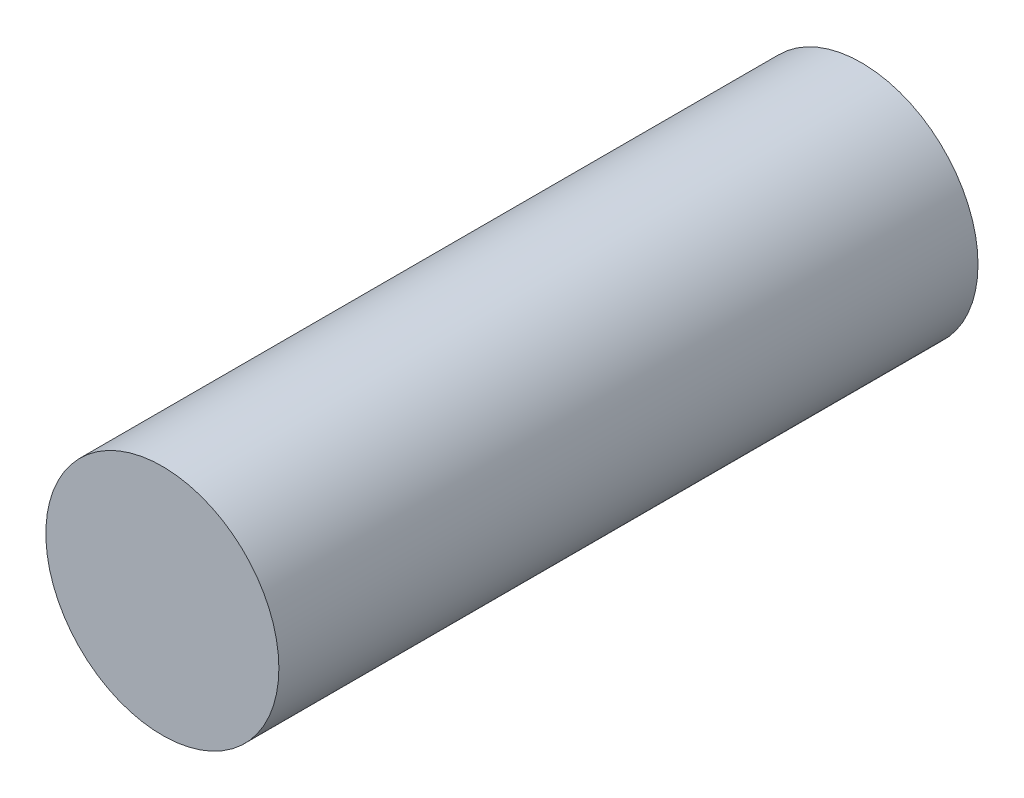
ISO-10303-21;
HEADER;
FILE_DESCRIPTION(('STEP AP214'),'2;1');
FILE_NAME('part.step','',(''),(''),'','','');
FILE_SCHEMA(('AUTOMOTIVE_DESIGN { 1 0 10303 214 1 1 1 1 }'));
ENDSEC;
DATA;
#1=APPLICATION_CONTEXT('core data for automotive mechanical design processes');
#2=APPLICATION_PROTOCOL_DEFINITION('international standard','automotive_design',2000,#1);
#3=PRODUCT_CONTEXT('',#1,'mechanical');
#4=PRODUCT('Part','Part','',(#3));
#5=PRODUCT_RELATED_PRODUCT_CATEGORY('part','',(#4));
#6=PRODUCT_DEFINITION_FORMATION('','',#4);
#7=PRODUCT_DEFINITION_CONTEXT('part definition',#1,'design');
#8=PRODUCT_DEFINITION('design','',#6,#7);
#9=PRODUCT_DEFINITION_SHAPE('','',#8);
#10=(LENGTH_UNIT() NAMED_UNIT(*) SI_UNIT(.MILLI.,.METRE.));
#11=(NAMED_UNIT(*) PLANE_ANGLE_UNIT() SI_UNIT($,.RADIAN.));
#12=(NAMED_UNIT(*) SI_UNIT($,.STERADIAN.) SOLID_ANGLE_UNIT());
#13=UNCERTAINTY_MEASURE_WITH_UNIT(LENGTH_MEASURE(1.E-05),#10,'distance_accuracy_value','');
#14=(GEOMETRIC_REPRESENTATION_CONTEXT(3) GLOBAL_UNCERTAINTY_ASSIGNED_CONTEXT((#13)) GLOBAL_UNIT_ASSIGNED_CONTEXT((#10,
#11,#12)) REPRESENTATION_CONTEXT('',''));
#15=CARTESIAN_POINT('',(0.,0.,0.));
#16=DIRECTION('',(0.,0.,1.));
#17=DIRECTION('',(1.,0.,0.));
#18=AXIS2_PLACEMENT_3D('',#15,#16,#17);
#19=CARTESIAN_POINT('',(0.,0.,47.625));
#20=DIRECTION('',(0.,0.,-1.));
#21=DIRECTION('',(-1.,0.,0.));
#22=AXIS2_PLACEMENT_3D('',#19,#20,#21);
#23=CYLINDRICAL_SURFACE('',#22,7.9375);
#24=CARTESIAN_POINT('',(0.,0.,47.625));
#25=DIRECTION('',(0.,0.,1.));
#26=DIRECTION('',(1.,0.,0.));
#27=AXIS2_PLACEMENT_3D('',#24,#25,#26);
#28=CIRCLE('',#27,7.9375);
#29=CARTESIAN_POINT('',(7.9375,0.,47.625));
#30=VERTEX_POINT('',#29);
#31=EDGE_CURVE('E10',#30,#30,#28,.T.);
#32=ORIENTED_EDGE('',*,*,#31,.F.);
#33=EDGE_LOOP('',(#32));
#34=FACE_BOUND('',#33,.T.);
#35=CARTESIAN_POINT('',(0.,0.,0.));
#36=DIRECTION('',(0.,0.,1.));
#37=DIRECTION('',(1.,0.,0.));
#38=AXIS2_PLACEMENT_3D('',#35,#36,#37);
#39=CIRCLE('',#38,7.9375);
#40=CARTESIAN_POINT('',(7.9375,0.,0.));
#41=VERTEX_POINT('',#40);
#42=EDGE_CURVE('E33',#41,#41,#39,.T.);
#43=ORIENTED_EDGE('',*,*,#42,.T.);
#44=EDGE_LOOP('',(#43));
#45=FACE_BOUND('',#44,.T.);
#46=ADVANCED_FACE('F30',(#34,#45),#23,.T.);
#47=CARTESIAN_POINT('',(0.,0.,47.625));
#48=DIRECTION('',(0.,0.,1.));
#49=DIRECTION('',(1.,0.,0.));
#50=AXIS2_PLACEMENT_3D('',#47,#48,#49);
#51=PLANE('',#50);
#52=ORIENTED_EDGE('',*,*,#31,.T.);
#53=EDGE_LOOP('',(#52));
#54=FACE_BOUND('',#53,.T.);
#55=ADVANCED_FACE('F45',(#54),#51,.T.);
#56=CARTESIAN_POINT('',(0.,0.,0.));
#57=DIRECTION('',(0.,0.,1.));
#58=DIRECTION('',(1.,0.,0.));
#59=AXIS2_PLACEMENT_3D('',#56,#57,#58);
#60=PLANE('',#59);
#61=ORIENTED_EDGE('',*,*,#42,.F.);
#62=EDGE_LOOP('',(#61));
#63=FACE_BOUND('',#62,.T.);
#64=ADVANCED_FACE('F43',(#63),#60,.F.);
#65=CLOSED_SHELL('',(#46,#55,#64));
#66=MANIFOLD_SOLID_BREP('B2',#65);
#67=ADVANCED_BREP_SHAPE_REPRESENTATION('',(#18,#66),#14);
#68=SHAPE_DEFINITION_REPRESENTATION(#9,#67);
ENDSEC;
END-ISO-10303-21;
